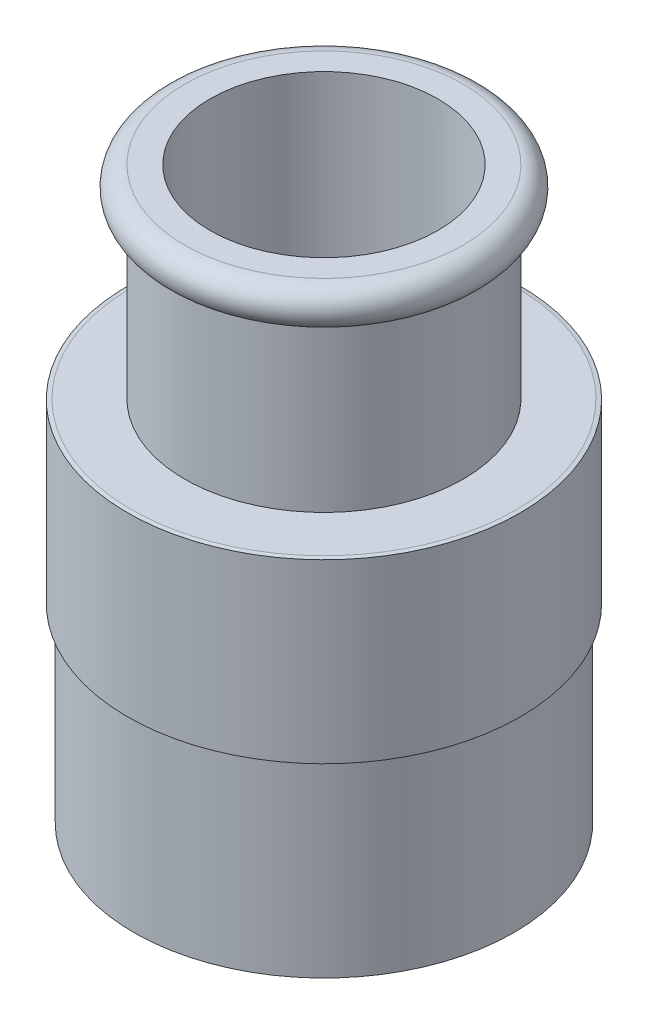
ISO-10303-21;
HEADER;
FILE_DESCRIPTION(('STEP AP214'),'2;1');
FILE_NAME('part.step','',(''),(''),'','','');
FILE_SCHEMA(('AUTOMOTIVE_DESIGN { 1 0 10303 214 1 1 1 1 }'));
ENDSEC;
DATA;
#1=APPLICATION_CONTEXT('core data for automotive mechanical design processes');
#2=APPLICATION_PROTOCOL_DEFINITION('international standard','automotive_design',2000,#1);
#3=PRODUCT_CONTEXT('',#1,'mechanical');
#4=PRODUCT('Part','Part','',(#3));
#5=PRODUCT_RELATED_PRODUCT_CATEGORY('part','',(#4));
#6=PRODUCT_DEFINITION_FORMATION('','',#4);
#7=PRODUCT_DEFINITION_CONTEXT('part definition',#1,'design');
#8=PRODUCT_DEFINITION('design','',#6,#7);
#9=PRODUCT_DEFINITION_SHAPE('','',#8);
#10=(LENGTH_UNIT() NAMED_UNIT(*) SI_UNIT(.MILLI.,.METRE.));
#11=(NAMED_UNIT(*) PLANE_ANGLE_UNIT() SI_UNIT($,.RADIAN.));
#12=(NAMED_UNIT(*) SI_UNIT($,.STERADIAN.) SOLID_ANGLE_UNIT());
#13=UNCERTAINTY_MEASURE_WITH_UNIT(LENGTH_MEASURE(1.E-05),#10,'distance_accuracy_value','');
#14=(GEOMETRIC_REPRESENTATION_CONTEXT(3) GLOBAL_UNCERTAINTY_ASSIGNED_CONTEXT((#13)) GLOBAL_UNIT_ASSIGNED_CONTEXT((#10,
#11,#12)) REPRESENTATION_CONTEXT('',''));
#15=CARTESIAN_POINT('',(0.,0.,0.));
#16=DIRECTION('',(0.,0.,1.));
#17=DIRECTION('',(1.,0.,0.));
#18=AXIS2_PLACEMENT_3D('',#15,#16,#17);
#19=CARTESIAN_POINT('',(-7.74999999999992,7.50000000000001,-2.08166817117217E-13));
#20=DIRECTION('',(0.,-1.,0.));
#21=DIRECTION('',(1.,0.,0.));
#22=AXIS2_PLACEMENT_3D('',#19,#20,#21);
#23=TOROIDAL_SURFACE('',#22,11.,1.5);
#24=CARTESIAN_POINT('',(-7.74999999999992,6.00000000000001,-2.08166817117217E-13));
#25=DIRECTION('',(0.,-1.,0.));
#26=DIRECTION('',(1.,0.,0.));
#27=AXIS2_PLACEMENT_3D('',#24,#25,#26);
#28=CIRCLE('',#27,11.);
#29=CARTESIAN_POINT('',(3.25000000000008,6.,-2.08166817117217E-13));
#30=VERTEX_POINT('',#29);
#31=EDGE_CURVE('E87',#30,#30,#28,.T.);
#32=ORIENTED_EDGE('',*,*,#31,.F.);
#33=EDGE_LOOP('',(#32));
#34=FACE_BOUND('',#33,.T.);
#35=CARTESIAN_POINT('',(-7.74999999999992,9.00000000000001,-2.08166817117217E-13));
#36=DIRECTION('',(0.,-1.,0.));
#37=DIRECTION('',(1.,0.,0.));
#38=AXIS2_PLACEMENT_3D('',#35,#36,#37);
#39=CIRCLE('',#38,11.);
#40=CARTESIAN_POINT('',(3.25000000000008,9.00000000000001,-2.08166817117217E-13));
#41=VERTEX_POINT('',#40);
#42=EDGE_CURVE('E56',#41,#41,#39,.T.);
#43=ORIENTED_EDGE('',*,*,#42,.T.);
#44=EDGE_LOOP('',(#43));
#45=FACE_BOUND('',#44,.T.);
#46=ADVANCED_FACE('F46',(#34,#45),#23,.T.);
#47=CARTESIAN_POINT('',(0.,9.00000000000001,0.));
#48=DIRECTION('',(0.,-1.,0.));
#49=DIRECTION('',(1.,0.,0.));
#50=AXIS2_PLACEMENT_3D('',#47,#48,#49);
#51=PLANE('',#50);
#52=ORIENTED_EDGE('',*,*,#42,.F.);
#53=EDGE_LOOP('',(#52));
#54=FACE_BOUND('',#53,.T.);
#55=CARTESIAN_POINT('',(-7.74999999999992,9.00000000000001,-2.08166817117217E-13));
#56=DIRECTION('',(0.,-1.,0.));
#57=DIRECTION('',(1.,0.,0.));
#58=AXIS2_PLACEMENT_3D('',#55,#56,#57);
#59=CIRCLE('',#58,9.);
#60=CARTESIAN_POINT('',(1.25000000000008,9.00000000000001,-2.08166817117217E-13));
#61=VERTEX_POINT('',#60);
#62=EDGE_CURVE('E60',#61,#61,#59,.T.);
#63=ORIENTED_EDGE('',*,*,#62,.T.);
#64=EDGE_LOOP('',(#63));
#65=FACE_BOUND('',#64,.T.);
#66=ADVANCED_FACE('F133',(#54,#65),#51,.F.);
#67=CARTESIAN_POINT('',(-7.74999999999959,-7.00000000000001,-2.08166817117217E-13));
#68=DIRECTION('',(0.,-1.,0.));
#69=DIRECTION('',(1.,0.,0.));
#70=AXIS2_PLACEMENT_3D('',#67,#68,#69);
#71=CYLINDRICAL_SURFACE('',#70,9.00000000000001);
#72=CARTESIAN_POINT('',(-3.3338070600053,-14.0256583509747,-7.84201759222349));
#73=CARTESIAN_POINT('',(-3.3338077631314,-13.9102139924207,-7.84201846239436));
#74=CARTESIAN_POINT('',(-3.33834019978371,-13.7947554466618,-7.84457573885014));
#75=CARTESIAN_POINT('',(-3.35641134279069,-13.5647231638968,-7.85471085666717));
#76=CARTESIAN_POINT('',(-3.36995445137929,-13.4501498870877,-7.8622911520561));
#77=CARTESIAN_POINT('',(-3.40590302083331,-13.2226250110531,-7.88221065515799));
#78=CARTESIAN_POINT('',(-3.42832301051078,-13.1096763865542,-7.89455766373124));
#79=CARTESIAN_POINT('',(-3.48174499224898,-12.886376674289,-7.92356701273656));
#80=CARTESIAN_POINT('',(-3.51275069696746,-12.7760267327015,-7.94023121982181));
#81=CARTESIAN_POINT('',(-3.61777196728077,-12.4511901489412,-7.99568554730766));
#82=CARTESIAN_POINT('',(-3.70402446887867,-12.2414762937421,-8.04007486362952));
#83=CARTESIAN_POINT('',(-3.90619199743052,-11.8396570207917,-8.13865548792399));
#84=CARTESIAN_POINT('',(-4.02210767130297,-11.647551987192,-8.1928470096635));
#85=CARTESIAN_POINT('',(-4.29109130793497,-11.2694445908325,-8.31018349018309));
#86=CARTESIAN_POINT('',(-4.44637603143697,-11.0851332830648,-8.37369766444777));
#87=CARTESIAN_POINT('',(-4.78520997116631,-10.743802343456,-8.49956479074144));
#88=CARTESIAN_POINT('',(-4.96877276945804,-10.5867959038006,-8.56191716853786));
#89=CARTESIAN_POINT('',(-5.26878091284757,-10.3701303328739,-8.65190504272495));
#90=CARTESIAN_POINT('',(-5.37651622673842,-10.2992612428091,-8.68215025267501));
#91=CARTESIAN_POINT('',(-5.59833046639471,-10.1669366137482,-8.73976088162172));
#92=CARTESIAN_POINT('',(-5.71240668142992,-10.1054770937188,-8.76712751695334));
#93=CARTESIAN_POINT('',(-5.94619184579826,-9.99255883462917,-8.81819689676113));
#94=CARTESIAN_POINT('',(-6.06590078098485,-9.94110007045377,-8.84189965043849));
#95=CARTESIAN_POINT('',(-6.31003744275174,-9.84878344089051,-8.88492290838183));
#96=CARTESIAN_POINT('',(-6.43446250742743,-9.80791969459374,-8.90424584297356));
#97=CARTESIAN_POINT('',(-6.67841927715461,-9.73970443264429,-8.93676708655787));
#98=CARTESIAN_POINT('',(-6.79770212038014,-9.71161892663727,-8.95029432828299));
#99=CARTESIAN_POINT('',(-7.03856502608222,-9.66542355026213,-8.97265166280743));
#100=CARTESIAN_POINT('',(-7.16014394750301,-9.64730885307467,-8.98148402830202));
#101=CARTESIAN_POINT('',(-7.40461378139546,-9.62127693930377,-8.99420293781649));
#102=CARTESIAN_POINT('',(-7.52750433364502,-9.61335699201245,-8.99809080623795));
#103=CARTESIAN_POINT('',(-7.77357028752872,-9.60781423961948,-9.00080995725409));
#104=CARTESIAN_POINT('',(-7.8967456721533,-9.61019083473288,-8.99964153438333));
#105=CARTESIAN_POINT('',(-8.13197553523486,-9.62457321279616,-8.99259455823565));
#106=CARTESIAN_POINT('',(-8.24409384821697,-9.63575212364101,-8.98712051239194));
#107=CARTESIAN_POINT('',(-8.46691629087498,-9.66659350863795,-8.97209590829407));
#108=CARTESIAN_POINT('',(-8.5776199517388,-9.68625872371731,-8.96254403298327));
#109=CARTESIAN_POINT('',(-8.79679101761472,-9.73385737481376,-8.9395950438762));
#110=CARTESIAN_POINT('',(-8.90525916462739,-9.7617880185488,-8.92619922871153));
#111=CARTESIAN_POINT('',(-9.11932794656144,-9.82563476476915,-8.89587865068654));
#112=CARTESIAN_POINT('',(-9.2249274631143,-9.86155393292461,-8.87895253319555));
#113=CARTESIAN_POINT('',(-9.53933003118357,-9.9819242523869,-8.82291749166518));
#114=CARTESIAN_POINT('',(-9.74281837207869,-10.0783492172575,-8.77887109005341));
#115=CARTESIAN_POINT('',(-10.1311215432521,-10.2996572449919,-8.68161715421619));
#116=CARTESIAN_POINT('',(-10.3159295809707,-10.4245506062264,-8.62840630648219));
#117=CARTESIAN_POINT('',(-10.6798700889215,-10.7124590735732,-8.51208558099455));
#118=CARTESIAN_POINT('',(-10.8569195998654,-10.8779229808642,-8.44851537878716));
#119=CARTESIAN_POINT('',(-11.1819135059513,-11.2358267174326,-8.32180548117886));
#120=CARTESIAN_POINT('',(-11.3298369382639,-11.4282858065178,-8.25866612719323));
#121=CARTESIAN_POINT('',(-11.531069441215,-11.7403021997997,-8.16758177169675));
#122=CARTESIAN_POINT('',(-11.5961872386628,-11.8516486848551,-8.13703406400477));
#123=CARTESIAN_POINT('',(-11.716698044986,-12.0802185521209,-8.07897110222101));
#124=CARTESIAN_POINT('',(-11.7720954204151,-12.1974392649628,-8.05145448859646));
#125=CARTESIAN_POINT('',(-11.872601174066,-12.4370137117006,-8.00045871231279));
#126=CARTESIAN_POINT('',(-11.9177129624952,-12.5593657283266,-7.97697821210922));
#127=CARTESIAN_POINT('',(-11.9970996434685,-12.8083024954249,-7.93499617233462));
#128=CARTESIAN_POINT('',(-12.0313811081825,-12.9348846271605,-7.91649161422922));
#129=CARTESIAN_POINT('',(-12.08641667267,-13.1813078714433,-7.88646911597485));
#130=CARTESIAN_POINT('',(-12.1080152293722,-13.3009079993787,-7.87451985862175));
#131=CARTESIAN_POINT('',(-12.1412934081097,-13.5418398355278,-7.85601091352799));
#132=CARTESIAN_POINT('',(-12.1529780964167,-13.6631706270491,-7.84944847302496));
#133=CARTESIAN_POINT('',(-12.1662664705011,-13.9065179990345,-7.84197992812656));
#134=CARTESIAN_POINT('',(-12.1678734565542,-14.0285343418892,-7.84107197198469));
#135=CARTESIAN_POINT('',(-12.1609905033904,-14.2721846653656,-7.84494604358916));
#136=CARTESIAN_POINT('',(-12.1525011875504,-14.3938186691291,-7.84972772003996));
#137=CARTESIAN_POINT('',(-12.1269560074274,-14.6230710053985,-7.86399668668682));
#138=CARTESIAN_POINT('',(-12.1108807679827,-14.7308336812506,-7.87294404215785));
#139=CARTESIAN_POINT('',(-12.0709195069884,-14.9444855849351,-7.89494560686005));
#140=CARTESIAN_POINT('',(-12.0470310177438,-15.0503742097251,-7.90800111353817));
#141=CARTESIAN_POINT('',(-11.9640014208234,-15.364198214528,-7.95274848585104));
#142=CARTESIAN_POINT('',(-11.8934786918382,-15.5684451826398,-7.99003164558137));
#143=CARTESIAN_POINT('',(-11.7206887744384,-15.9716298771881,-8.07733587139174));
#144=CARTESIAN_POINT('',(-11.617099707661,-16.1698807794917,-8.12786798994592));
#145=CARTESIAN_POINT('',(-11.3822525413525,-16.5473502149746,-8.23549706221417));
#146=CARTESIAN_POINT('',(-11.2509803205842,-16.7265589642785,-8.29259735958781));
#147=CARTESIAN_POINT('',(-10.9460380656599,-17.0833776512028,-8.4151939621405));
#148=CARTESIAN_POINT('',(-10.7691653366913,-17.2581933430749,-8.48087294357052));
#149=CARTESIAN_POINT('',(-10.3873390497235,-17.5765589484486,-8.60725036108679));
#150=CARTESIAN_POINT('',(-10.1823771264523,-17.7200995147676,-8.66794730482473));
#151=CARTESIAN_POINT('',(-9.85494939283785,-17.9100399334295,-8.75113439562429));
#152=CARTESIAN_POINT('',(-9.74103204490809,-17.9696625498138,-8.77781554194729));
#153=CARTESIAN_POINT('',(-9.50778025298303,-18.0789941292504,-8.82747929752543));
#154=CARTESIAN_POINT('',(-9.38844822853798,-18.1287074677407,-8.85046353827845));
#155=CARTESIAN_POINT('',(-9.14526171995317,-18.2176465631616,-8.89204485216366));
#156=CARTESIAN_POINT('',(-9.02140931804392,-18.2568770812138,-8.91064391651649));
#157=CARTESIAN_POINT('',(-8.77012508386624,-18.3243816146543,-8.94289551092558));
#158=CARTESIAN_POINT('',(-8.64269365855854,-18.3526568703687,-8.95654860094072));
#159=CARTESIAN_POINT('',(-8.39691243529486,-18.3958311858445,-8.97749014152461));
#160=CARTESIAN_POINT('',(-8.27877161895538,-18.4117015463309,-8.98523915644647));
#161=CARTESIAN_POINT('',(-8.04138378668453,-18.4338397060883,-8.9960662775663));
#162=CARTESIAN_POINT('',(-7.9221368516387,-18.4401082020181,-8.99914472263507));
#163=CARTESIAN_POINT('',(-7.68353241423287,-18.4429622521672,-9.00054510822315));
#164=CARTESIAN_POINT('',(-7.56417495079065,-18.4395504408478,-8.9988683428561));
#165=CARTESIAN_POINT('',(-7.32629015927955,-18.4230946258239,-8.990808341785));
#166=CARTESIAN_POINT('',(-7.20776281112197,-18.4100508560303,-8.98442522037421));
#167=CARTESIAN_POINT('',(-6.97979984845198,-18.3756006092265,-8.96766553588944));
#168=CARTESIAN_POINT('',(-6.87025750104089,-18.3547651268026,-8.95756223753074));
#169=CARTESIAN_POINT('',(-6.65343599150914,-18.3049923708529,-8.9336147110522));
#170=CARTESIAN_POINT('',(-6.5461575644824,-18.2760525080747,-8.91976928741759));
#171=CARTESIAN_POINT('',(-6.22879745872864,-18.1774857627575,-8.87307724848967));
#172=CARTESIAN_POINT('',(-6.02299965518584,-18.0960823292719,-8.83506000637513));
#173=CARTESIAN_POINT('',(-5.61907922542523,-17.9005213758236,-8.7466501817986));
#174=CARTESIAN_POINT('',(-5.42168580955639,-17.7850871634843,-8.69578911773553));
#175=CARTESIAN_POINT('',(-5.04820170752946,-17.5263265591519,-8.58709167336437));
#176=CARTESIAN_POINT('',(-4.87212089171289,-17.382987323266,-8.52925208571858));
#177=CARTESIAN_POINT('',(-4.52848448081582,-17.0565143552137,-8.40584956588167));
#178=CARTESIAN_POINT('',(-4.36337930321249,-16.8708786974291,-8.34007898213355));
#179=CARTESIAN_POINT('',(-4.06576411109726,-16.4732659208213,-8.21295660765341));
#180=CARTESIAN_POINT('',(-3.93328114699056,-16.2612671593953,-8.15160851366768));
#181=CARTESIAN_POINT('',(-3.76064724883979,-15.9241786020399,-8.06779464391152));
#182=CARTESIAN_POINT('',(-3.70692527650762,-15.8069582372589,-8.04092814585371));
#183=CARTESIAN_POINT('',(-3.60970586179811,-15.5675368276295,-7.99130420269526));
#184=CARTESIAN_POINT('',(-3.56620316539554,-15.445338380246,-7.96854464749817));
#185=CARTESIAN_POINT('',(-3.49004882386269,-15.1971479314087,-7.9280939758925));
#186=CARTESIAN_POINT('',(-3.45736911173842,-15.0711666811198,-7.91038976628737));
#187=CARTESIAN_POINT('',(-3.40319308264552,-14.8162204884645,-7.88075061079555));
#188=CARTESIAN_POINT('',(-3.38168884451601,-14.6872577272951,-7.86881157898486));
#189=CARTESIAN_POINT('',(-3.35525508092545,-14.4693425521935,-7.85406634151684));
#190=CARTESIAN_POINT('',(-3.34721880473535,-14.3808677669327,-7.84955760278083));
#191=CARTESIAN_POINT('',(-3.33649435366193,-14.2034842616823,-7.84353279798916));
#192=CARTESIAN_POINT('',(-3.33380651844589,-14.1145755144921,-7.84201692200342));
#193=CARTESIAN_POINT('',(-3.3338070600053,-14.0256583509747,-7.84201759222349));
#194=B_SPLINE_CURVE_WITH_KNOTS('',3,(#72,#73,#74,#75,#76,#77,#78,#79,#80,#81,#82,#83,#84,#85,
#86,#87,#88,#89,#90,#91,#92,#93,#94,#95,#96,#97,#98,#99,#100,#101,#102,#103,#104,#105,#106,#107,
#108,#109,#110,#111,#112,#113,#114,#115,#116,#117,#118,#119,#120,#121,#122,#123,#124,#125,#126,
#127,#128,#129,#130,#131,#132,#133,#134,#135,#136,#137,#138,#139,#140,#141,#142,#143,#144,#145,
#146,#147,#148,#149,#150,#151,#152,#153,#154,#155,#156,#157,#158,#159,#160,#161,#162,#163,#164,
#165,#166,#167,#168,#169,#170,#171,#172,#173,#174,#175,#176,#177,#178,#179,#180,#181,#182,#183,
#184,#185,#186,#187,#188,#189,#190,#191,#192,#193),.UNSPECIFIED.,.T.,.F.,(4,2,2,2,2,2,2,2,2,2,2,
2,2,2,2,2,2,2,2,2,2,2,2,2,2,2,2,2,2,2,2,2,2,2,2,2,2,2,2,2,2,2,2,2,2,2,2,2,2,2,2,2,2,2,2,2,2,2,2,
2,4),(0.,0.34624084397861,0.692650970953367,1.03963042757895,1.38676016092398,2.07667850369042,
2.76661189403805,3.51123931525317,4.25622550532876,4.65315428048575,5.04991465479569,
5.4466740326974,5.84321271014664,6.21258119854951,6.58177071987532,6.95086133159832,
7.31993044367476,7.65795170952465,7.99608223211577,8.33409865535571,8.67224502004265,
9.35744709481429,10.0428974341942,10.7913503076324,11.5403399095324,11.937578868615,
12.3346389228253,12.7315671388998,13.1282540221221,13.4941015054397,13.8597619173803,
14.2253025755166,14.5908206652108,14.9183997647853,15.2460824252524,15.9009888631561,
16.5863029221307,17.2719674105763,18.0402457907044,18.8087534718368,19.2022548170799,
19.5955820251765,19.9887302858169,20.3818340222237,20.7397255106492,21.0975910311998,
21.4553591692664,21.8131186192655,22.1486121777807,22.4842130449866,23.1548393497198,
23.8547927970755,24.5550691781581,25.3227247286801,26.0910146932446,26.4856970760068,
26.880176094851,27.2736239604033,27.6667925689703,27.9334560864959,28.2001365386724),.UNSPECIFIED.);
#195=CARTESIAN_POINT('',(-3.3338070600053,-14.0256583509747,-7.84201759222349));
#196=VERTEX_POINT('',#195);
#197=EDGE_CURVE('E90',#196,#196,#194,.T.);
#198=ORIENTED_EDGE('',*,*,#197,.F.);
#199=EDGE_LOOP('',(#198));
#200=FACE_BOUND('',#199,.T.);
#201=CARTESIAN_POINT('',(-7.74999999999981,-36.,-2.22044604925031E-13));
#202=DIRECTION('',(0.,-1.,0.));
#203=DIRECTION('',(1.,0.,0.));
#204=AXIS2_PLACEMENT_3D('',#201,#202,#203);
#205=CIRCLE('',#204,9.00000000000001);
#206=CARTESIAN_POINT('',(1.2500000000002,-36.,-2.22044604925031E-13));
#207=VERTEX_POINT('',#206);
#208=EDGE_CURVE('E64',#207,#207,#205,.T.);
#209=ORIENTED_EDGE('',*,*,#208,.T.);
#210=EDGE_LOOP('',(#209));
#211=FACE_BOUND('',#210,.T.);
#212=ORIENTED_EDGE('',*,*,#62,.F.);
#213=EDGE_LOOP('',(#212));
#214=FACE_BOUND('',#213,.T.);
#215=ADVANCED_FACE('F95',(#200,#211,#214),#71,.F.);
#216=CARTESIAN_POINT('',(0.,-36.,0.));
#217=DIRECTION('',(0.,-1.,0.));
#218=DIRECTION('',(1.,0.,0.));
#219=AXIS2_PLACEMENT_3D('',#216,#217,#218);
#220=PLANE('',#219);
#221=CARTESIAN_POINT('',(-7.74999999999981,-36.,-2.22044604925031E-13));
#222=DIRECTION('',(0.,-1.,0.));
#223=DIRECTION('',(1.,0.,0.));
#224=AXIS2_PLACEMENT_3D('',#221,#222,#223);
#225=CIRCLE('',#224,15.);
#226=CARTESIAN_POINT('',(7.2500000000002,-36.,-2.22044604925031E-13));
#227=VERTEX_POINT('',#226);
#228=EDGE_CURVE('E69',#227,#227,#225,.T.);
#229=ORIENTED_EDGE('',*,*,#228,.T.);
#230=EDGE_LOOP('',(#229));
#231=FACE_BOUND('',#230,.T.);
#232=ORIENTED_EDGE('',*,*,#208,.F.);
#233=EDGE_LOOP('',(#232));
#234=FACE_BOUND('',#233,.T.);
#235=ADVANCED_FACE('F126',(#231,#234),#220,.T.);
#236=CARTESIAN_POINT('',(-7.74999999999959,-7.00000000000001,-2.08166817117217E-13));
#237=DIRECTION('',(0.,-1.,0.));
#238=DIRECTION('',(1.,0.,0.));
#239=AXIS2_PLACEMENT_3D('',#236,#237,#238);
#240=CYLINDRICAL_SURFACE('',#239,15.);
#241=ORIENTED_EDGE('',*,*,#228,.F.);
#242=EDGE_LOOP('',(#241));
#243=FACE_BOUND('',#242,.T.);
#244=CARTESIAN_POINT('',(-7.74999999999981,-21.,-2.22044604925031E-13));
#245=DIRECTION('',(0.,-1.,0.));
#246=DIRECTION('',(1.,0.,0.));
#247=AXIS2_PLACEMENT_3D('',#244,#245,#246);
#248=CIRCLE('',#247,15.);
#249=CARTESIAN_POINT('',(7.25000000000019,-21.,-2.22044604925031E-13));
#250=VERTEX_POINT('',#249);
#251=EDGE_CURVE('E72',#250,#250,#248,.T.);
#252=ORIENTED_EDGE('',*,*,#251,.T.);
#253=EDGE_LOOP('',(#252));
#254=FACE_BOUND('',#253,.T.);
#255=ADVANCED_FACE('F123',(#243,#254),#240,.T.);
#256=CARTESIAN_POINT('',(0.,-21.,0.));
#257=DIRECTION('',(0.,1.,0.));
#258=DIRECTION('',(-1.,0.,0.));
#259=AXIS2_PLACEMENT_3D('',#256,#257,#258);
#260=PLANE('',#259);
#261=ORIENTED_EDGE('',*,*,#251,.F.);
#262=EDGE_LOOP('',(#261));
#263=FACE_BOUND('',#262,.T.);
#264=CARTESIAN_POINT('',(-7.74999999999981,-21.,-2.22044604925031E-13));
#265=DIRECTION('',(0.,-1.,0.));
#266=DIRECTION('',(1.,0.,0.));
#267=AXIS2_PLACEMENT_3D('',#264,#265,#266);
#268=CIRCLE('',#267,15.5);
#269=CARTESIAN_POINT('',(7.75000000000019,-21.,-2.22044604925031E-13));
#270=VERTEX_POINT('',#269);
#271=EDGE_CURVE('E75',#270,#270,#268,.T.);
#272=ORIENTED_EDGE('',*,*,#271,.T.);
#273=EDGE_LOOP('',(#272));
#274=FACE_BOUND('',#273,.T.);
#275=ADVANCED_FACE('F119',(#263,#274),#260,.F.);
#276=CARTESIAN_POINT('',(-7.74999999999959,-7.00000000000001,-2.08166817117217E-13));
#277=DIRECTION('',(0.,-1.,0.));
#278=DIRECTION('',(1.,0.,0.));
#279=AXIS2_PLACEMENT_3D('',#276,#277,#278);
#280=CYLINDRICAL_SURFACE('',#279,15.5);
#281=CARTESIAN_POINT('',(-7.75000000000015,-18.4418512909697,-15.5000000000001));
#282=CARTESIAN_POINT('',(-7.992819589936,-18.4418469389754,-15.4999970747609));
#283=CARTESIAN_POINT('',(-8.23568399395542,-18.4217577507388,-15.4942387546371));
#284=CARTESIAN_POINT('',(-8.71437559527181,-18.3420997719948,-15.471828597492));
#285=CARTESIAN_POINT('',(-8.95020006235468,-18.2825158673613,-15.4551725900959));
#286=CARTESIAN_POINT('',(-9.40783592503473,-18.125993588099,-15.4127983553024));
#287=CARTESIAN_POINT('',(-9.6296662989132,-18.0291071270142,-15.3870927263985));
#288=CARTESIAN_POINT('',(-10.0539320237567,-17.8009334685521,-15.3293117684528));
#289=CARTESIAN_POINT('',(-10.2563653734651,-17.6696427267766,-15.2972357832065));
#290=CARTESIAN_POINT('',(-10.6413857234265,-17.372765114574,-15.2292167751906));
#291=CARTESIAN_POINT('',(-10.8233933354124,-17.2064436364521,-15.1932004942289));
#292=CARTESIAN_POINT('',(-11.1573468622083,-16.8457935638626,-15.1218123956898));
#293=CARTESIAN_POINT('',(-11.3092882983551,-16.6514608042701,-15.0864406748376));
#294=CARTESIAN_POINT('',(-11.5817400126455,-16.235532082426,-15.0195838167914));
#295=CARTESIAN_POINT('',(-11.7015621311521,-16.013469233889,-14.9881903847001));
#296=CARTESIAN_POINT('',(-11.9019329842722,-15.5513083348127,-14.9339313145441));
#297=CARTESIAN_POINT('',(-11.9824901146805,-15.311214152487,-14.9110638536687));
#298=CARTESIAN_POINT('',(-12.0999908287507,-14.8262719896586,-14.8772060093795));
#299=CARTESIAN_POINT('',(-12.1379945270183,-14.5817015034929,-14.8659275347733));
#300=CARTESIAN_POINT('',(-12.1726176618865,-14.0894161355347,-14.8556658418338));
#301=CARTESIAN_POINT('',(-12.1692460352642,-13.841701944307,-14.8566799683851));
#302=CARTESIAN_POINT('',(-12.1220510424992,-13.358616914192,-14.8706323814041));
#303=CARTESIAN_POINT('',(-12.079534204271,-13.1231055025159,-14.8831855151403));
#304=CARTESIAN_POINT('',(-11.9573580413106,-12.6627065927911,-14.9181814129083));
#305=CARTESIAN_POINT('',(-11.8776953755785,-12.4378200523774,-14.9406250665112));
#306=CARTESIAN_POINT('',(-11.6824795159662,-12.001761566949,-14.9931949522039));
#307=CARTESIAN_POINT('',(-11.5664867426439,-11.7907981322741,-15.0234144228951));
#308=CARTESIAN_POINT('',(-11.3022092496615,-11.3908820619076,-15.0880837026551));
#309=CARTESIAN_POINT('',(-11.1539173764275,-11.2019343164824,-15.1225344481243));
#310=CARTESIAN_POINT('',(-10.8226728789818,-10.8439766195291,-15.1933658819683));
#311=CARTESIAN_POINT('',(-10.6386298149385,-10.6759788800945,-15.2297705190989));
#312=CARTESIAN_POINT('',(-10.2445320702929,-10.373009034192,-15.2992577673974));
#313=CARTESIAN_POINT('',(-10.0344760574148,-10.2380386203019,-15.3323402082587));
#314=CARTESIAN_POINT('',(-9.59260285798036,-10.0044201862361,-15.3917093360273));
#315=CARTESIAN_POINT('',(-9.36067165269351,-9.90597735708508,-15.41795739272));
#316=CARTESIAN_POINT('',(-8.88262778139582,-9.74978405847442,-15.4604219085496));
#317=CARTESIAN_POINT('',(-8.63651868594831,-9.69202339165417,-15.4766408814446));
#318=CARTESIAN_POINT('',(-8.14572561273049,-9.62047434104974,-15.4968302712065));
#319=CARTESIAN_POINT('',(-7.90125734032595,-9.60531217234763,-15.5011832201283));
#320=CARTESIAN_POINT('',(-7.41326298842846,-9.6155663961862,-15.4982618925891));
#321=CARTESIAN_POINT('',(-7.1697368000402,-9.64097794924753,-15.4909890028139));
#322=CARTESIAN_POINT('',(-6.69559318620801,-9.73053938137625,-15.4658821984753));
#323=CARTESIAN_POINT('',(-6.46481493129984,-9.79390351627151,-15.4482626354982));
#324=CARTESIAN_POINT('',(-6.01720077292173,-9.95664146685914,-15.4044806916199));
#325=CARTESIAN_POINT('',(-5.80036648135271,-10.0560194369169,-15.3783173251851));
#326=CARTESIAN_POINT('',(-5.3816079535236,-10.2903818213415,-15.3194786441259));
#327=CARTESIAN_POINT('',(-5.1801060446596,-10.4260878129181,-15.2866750769249));
#328=CARTESIAN_POINT('',(-4.80225962316981,-10.7283635343213,-15.2183361738695));
#329=CARTESIAN_POINT('',(-4.62592081712814,-10.8949402455003,-15.1828002211572));
#330=CARTESIAN_POINT('',(-4.29747540250458,-11.2606675191876,-15.1115608839154));
#331=CARTESIAN_POINT('',(-4.14634305565474,-11.4607010638654,-15.0758896201627));
#332=CARTESIAN_POINT('',(-3.87974453626915,-11.8840591845472,-15.0096656070889));
#333=CARTESIAN_POINT('',(-3.76427710902319,-12.1073829408199,-14.9791126777196));
#334=CARTESIAN_POINT('',(-3.57313000032588,-12.5700458437238,-14.9269415068781));
#335=CARTESIAN_POINT('',(-3.49723833636013,-12.8092917580651,-14.9052757983402));
#336=CARTESIAN_POINT('',(-3.38699905072705,-13.2978863286065,-14.8733849263988));
#337=CARTESIAN_POINT('',(-3.35263892850388,-13.5472319215449,-14.8631563206174));
#338=CARTESIAN_POINT('',(-3.32722909216193,-14.0388972515169,-14.8556133958284));
#339=CARTESIAN_POINT('',(-3.3346020751083,-14.2811293909193,-14.8578287332284));
#340=CARTESIAN_POINT('',(-3.38873357573147,-14.7607443439271,-14.8738069920954));
#341=CARTESIAN_POINT('',(-3.435490792876,-14.9981273173947,-14.8875695322547));
#342=CARTESIAN_POINT('',(-3.56609174979975,-15.4590045214999,-14.924792037782));
#343=CARTESIAN_POINT('',(-3.64955672605944,-15.682614674246,-14.9481528073872));
#344=CARTESIAN_POINT('',(-3.85091096925351,-16.1128338693932,-15.0019303800743));
#345=CARTESIAN_POINT('',(-3.96880630020797,-16.3194399087341,-15.0323484259195));
#346=CARTESIAN_POINT('',(-4.24026688676371,-16.7172040972961,-15.0980747941319));
#347=CARTESIAN_POINT('',(-4.39488690275739,-16.9076211569251,-15.133511993923));
#348=CARTESIAN_POINT('',(-4.73345941668101,-17.260317955792,-15.2046163160025));
#349=CARTESIAN_POINT('',(-4.91741927857985,-17.4225906097022,-15.2402834938505));
#350=CARTESIAN_POINT('',(-5.31509726991059,-17.7184860789174,-15.3089168379772));
#351=CARTESIAN_POINT('',(-5.52945388675067,-17.8512741251165,-15.3417910973856));
#352=CARTESIAN_POINT('',(-5.97838515729077,-18.0787284639353,-15.4000802037457));
#353=CARTESIAN_POINT('',(-6.21294859115752,-18.1734157484626,-15.4254991561574));
#354=CARTESIAN_POINT('',(-6.66336744292963,-18.3116689046891,-15.4632901192305));
#355=CARTESIAN_POINT('',(-6.8775532113075,-18.3603641110036,-15.476948975678));
#356=CARTESIAN_POINT('',(-7.31114758196091,-18.4254551370087,-15.4953046458623));
#357=CARTESIAN_POINT('',(-7.53055549033031,-18.4418552240183,-15.5000026436406));
#358=CARTESIAN_POINT('',(-7.75000000000015,-18.4418512909697,-15.5000000000001));
#359=B_SPLINE_CURVE_WITH_KNOTS('',3,(#281,#282,#283,#284,#285,#286,#287,#288,#289,#290,#291,
#292,#293,#294,#295,#296,#297,#298,#299,#300,#301,#302,#303,#304,#305,#306,#307,#308,#309,#310,
#311,#312,#313,#314,#315,#316,#317,#318,#319,#320,#321,#322,#323,#324,#325,#326,#327,#328,#329,
#330,#331,#332,#333,#334,#335,#336,#337,#338,#339,#340,#341,#342,#343,#344,#345,#346,#347,#348,
#349,#350,#351,#352,#353,#354,#355,#356,#357,#358),.UNSPECIFIED.,.T.,.F.,(4,2,2,2,2,2,2,2,2,2,2,
2,2,2,2,2,2,2,2,2,2,2,2,2,2,2,2,2,2,2,2,2,2,2,2,2,2,2,4),(0.,0.727653317179866,1.45558525893162,
2.18250778668826,2.90950523292858,3.65361695346833,4.39783943372848,5.15692175518967,
5.91584169538744,6.65540242563368,7.39480341881309,8.11038686287928,8.82603468094888,
9.55069978893463,10.275525558555,11.0275075768746,11.7795281245489,12.5357113364638,
13.2917049365352,14.023021663272,14.7542511678446,15.4708411280431,16.1875137765918,
16.9196400952844,17.6519321853894,18.408033152753,19.1641075170652,19.9160893546727,
20.6678447972745,21.3913820671346,22.1148954455391,22.8311123743157,23.547455522408,
24.2875933011037,25.0279171391844,25.7870927749003,26.5458495623578,27.2035420859139,
27.8611476993669),.UNSPECIFIED.);
#360=CARTESIAN_POINT('',(-7.75000000000015,-18.4418512909697,-15.5000000000001));
#361=VERTEX_POINT('',#360);
#362=EDGE_CURVE('E12',#361,#361,#359,.T.);
#363=ORIENTED_EDGE('',*,*,#362,.F.);
#364=EDGE_LOOP('',(#363));
#365=FACE_BOUND('',#364,.T.);
#366=CARTESIAN_POINT('',(-7.74999999999959,-7.05131670194947,-2.08166817117217E-13));
#367=DIRECTION('',(0.,-1.,0.));
#368=DIRECTION('',(1.,0.,0.));
#369=AXIS2_PLACEMENT_3D('',#366,#367,#368);
#370=CIRCLE('',#369,15.5);
#371=CARTESIAN_POINT('',(7.75000000000041,-7.05131670194947,-2.08166817117217E-13));
#372=VERTEX_POINT('',#371);
#373=EDGE_CURVE('E78',#372,#372,#370,.T.);
#374=ORIENTED_EDGE('',*,*,#373,.T.);
#375=EDGE_LOOP('',(#374));
#376=FACE_BOUND('',#375,.T.);
#377=ORIENTED_EDGE('',*,*,#271,.F.);
#378=EDGE_LOOP('',(#377));
#379=FACE_BOUND('',#378,.T.);
#380=ADVANCED_FACE('F114',(#365,#376,#379),#280,.T.);
#381=CARTESIAN_POINT('',(-7.74999999999959,-7.00000000000001,-2.08166817117217E-13));
#382=DIRECTION('',(0.,-1.,0.));
#383=DIRECTION('',(1.,0.,0.));
#384=AXIS2_PLACEMENT_3D('',#381,#382,#383);
#385=CONICAL_SURFACE('',#384,15.1837722339832,1.40992104959657);
#386=ORIENTED_EDGE('',*,*,#373,.F.);
#387=EDGE_LOOP('',(#386));
#388=FACE_BOUND('',#387,.T.);
#389=CARTESIAN_POINT('',(-7.74999999999959,-7.00000000000001,-2.08166817117217E-13));
#390=DIRECTION('',(0.,-1.,0.));
#391=DIRECTION('',(1.,0.,0.));
#392=AXIS2_PLACEMENT_3D('',#389,#390,#391);
#393=CIRCLE('',#392,15.1837722339832);
#394=CARTESIAN_POINT('',(7.43377223398357,-7.00000000000001,-2.08166817117217E-13));
#395=VERTEX_POINT('',#394);
#396=EDGE_CURVE('E81',#395,#395,#393,.T.);
#397=ORIENTED_EDGE('',*,*,#396,.T.);
#398=EDGE_LOOP('',(#397));
#399=FACE_BOUND('',#398,.T.);
#400=ADVANCED_FACE('F111',(#388,#399),#385,.T.);
#401=CARTESIAN_POINT('',(0.,-7.00000000000001,0.));
#402=DIRECTION('',(0.,-1.,0.));
#403=DIRECTION('',(1.,0.,0.));
#404=AXIS2_PLACEMENT_3D('',#401,#402,#403);
#405=PLANE('',#404);
#406=ORIENTED_EDGE('',*,*,#396,.F.);
#407=EDGE_LOOP('',(#406));
#408=FACE_BOUND('',#407,.T.);
#409=CARTESIAN_POINT('',(-7.74999999999959,-7.00000000000001,-2.08166817117217E-13));
#410=DIRECTION('',(0.,-1.,0.));
#411=DIRECTION('',(1.,0.,0.));
#412=AXIS2_PLACEMENT_3D('',#409,#410,#411);
#413=CIRCLE('',#412,11.);
#414=CARTESIAN_POINT('',(3.25000000000041,-7.00000000000001,-2.08166817117217E-13));
#415=VERTEX_POINT('',#414);
#416=EDGE_CURVE('E84',#415,#415,#413,.T.);
#417=ORIENTED_EDGE('',*,*,#416,.T.);
#418=EDGE_LOOP('',(#417));
#419=FACE_BOUND('',#418,.T.);
#420=ADVANCED_FACE('F107',(#408,#419),#405,.F.);
#421=CARTESIAN_POINT('',(-7.74999999999959,-7.00000000000001,-2.08166817117217E-13));
#422=DIRECTION('',(0.,-1.,0.));
#423=DIRECTION('',(1.,0.,0.));
#424=AXIS2_PLACEMENT_3D('',#421,#422,#423);
#425=CYLINDRICAL_SURFACE('',#424,11.);
#426=ORIENTED_EDGE('',*,*,#31,.T.);
#427=EDGE_LOOP('',(#426));
#428=FACE_BOUND('',#427,.T.);
#429=ORIENTED_EDGE('',*,*,#416,.F.);
#430=EDGE_LOOP('',(#429));
#431=FACE_BOUND('',#430,.T.);
#432=ADVANCED_FACE('F102',(#428,#431),#425,.T.);
#433=CARTESIAN_POINT('',(-7.75000000000015,-14.0256583509747,-15.5000000000001));
#434=DIRECTION('',(0.,0.,1.));
#435=DIRECTION('',(1.,0.,0.));
#436=AXIS2_PLACEMENT_3D('',#433,#434,#435);
#437=CYLINDRICAL_SURFACE('',#436,4.41619293999494);
#438=ORIENTED_EDGE('',*,*,#197,.T.);
#439=EDGE_LOOP('',(#438));
#440=FACE_BOUND('',#439,.T.);
#441=ORIENTED_EDGE('',*,*,#362,.T.);
#442=EDGE_LOOP('',(#441));
#443=FACE_BOUND('',#442,.T.);
#444=ADVANCED_FACE('F98',(#440,#443),#437,.F.);
#445=CLOSED_SHELL('',(#46,#66,#215,#235,#255,#275,#380,#400,#420,#432,#444));
#446=MANIFOLD_SOLID_BREP('B2',#445);
#447=ADVANCED_BREP_SHAPE_REPRESENTATION('',(#18,#446),#14);
#448=SHAPE_DEFINITION_REPRESENTATION(#9,#447);
ENDSEC;
END-ISO-10303-21;
